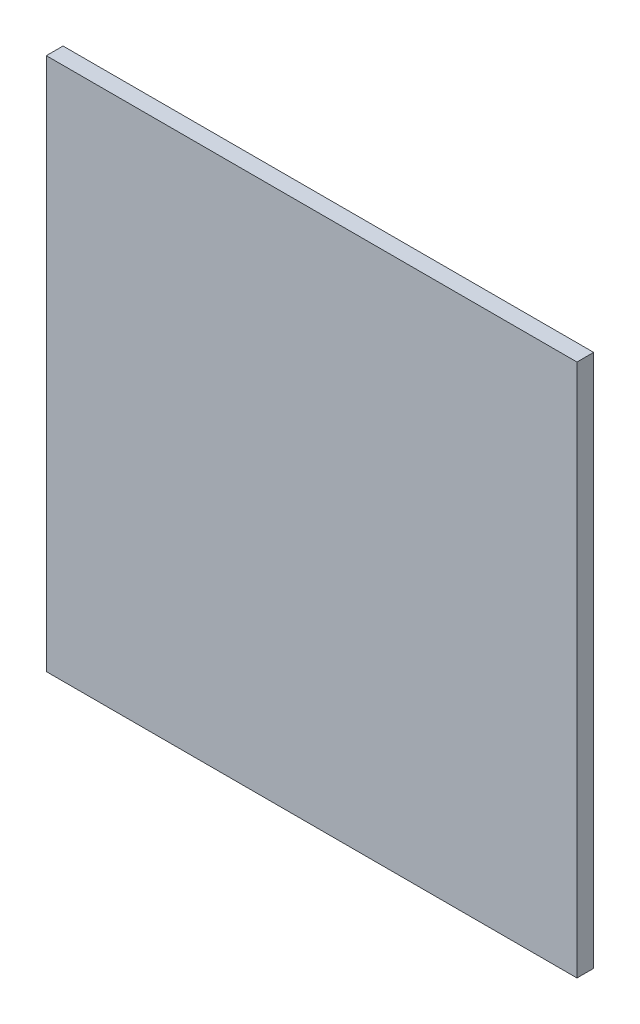
ISO-10303-21;
HEADER;
FILE_DESCRIPTION(('STEP AP214'),'2;1');
FILE_NAME('part.step','',(''),(''),'','','');
FILE_SCHEMA(('AUTOMOTIVE_DESIGN { 1 0 10303 214 1 1 1 1 }'));
ENDSEC;
DATA;
#1=APPLICATION_CONTEXT('core data for automotive mechanical design processes');
#2=APPLICATION_PROTOCOL_DEFINITION('international standard','automotive_design',2000,#1);
#3=PRODUCT_CONTEXT('',#1,'mechanical');
#4=PRODUCT('Part','Part','',(#3));
#5=PRODUCT_RELATED_PRODUCT_CATEGORY('part','',(#4));
#6=PRODUCT_DEFINITION_FORMATION('','',#4);
#7=PRODUCT_DEFINITION_CONTEXT('part definition',#1,'design');
#8=PRODUCT_DEFINITION('design','',#6,#7);
#9=PRODUCT_DEFINITION_SHAPE('','',#8);
#10=(LENGTH_UNIT() NAMED_UNIT(*) SI_UNIT(.MILLI.,.METRE.));
#11=(NAMED_UNIT(*) PLANE_ANGLE_UNIT() SI_UNIT($,.RADIAN.));
#12=(NAMED_UNIT(*) SI_UNIT($,.STERADIAN.) SOLID_ANGLE_UNIT());
#13=UNCERTAINTY_MEASURE_WITH_UNIT(LENGTH_MEASURE(1.E-05),#10,'distance_accuracy_value','');
#14=(GEOMETRIC_REPRESENTATION_CONTEXT(3) GLOBAL_UNCERTAINTY_ASSIGNED_CONTEXT((#13)) GLOBAL_UNIT_ASSIGNED_CONTEXT((#10,
#11,#12)) REPRESENTATION_CONTEXT('',''));
#15=CARTESIAN_POINT('',(0.,0.,0.));
#16=DIRECTION('',(0.,0.,1.));
#17=DIRECTION('',(1.,0.,0.));
#18=AXIS2_PLACEMENT_3D('',#15,#16,#17);
#19=CARTESIAN_POINT('',(-40.5473581800681,24.0513832683013,3.));
#20=DIRECTION('',(1.,0.,0.));
#21=DIRECTION('',(0.,0.,-1.));
#22=AXIS2_PLACEMENT_3D('',#19,#20,#21);
#23=PLANE('',#22);
#24=DIRECTION('',(0.,-1.,0.));
#25=VECTOR('',#24,1.);
#26=CARTESIAN_POINT('',(-40.5473581800681,24.0513832683013,0.));
#27=LINE('',#26,#25);
#28=CARTESIAN_POINT('',(-40.5473581800681,24.0513832683013,0.));
#29=VERTEX_POINT('',#28);
#30=CARTESIAN_POINT('',(-40.5473581800681,-71.6504559144682,0.));
#31=VERTEX_POINT('',#30);
#32=EDGE_CURVE('E96',#29,#31,#27,.T.);
#33=ORIENTED_EDGE('',*,*,#32,.T.);
#34=DIRECTION('',(0.,0.,-1.));
#35=VECTOR('',#34,1.);
#36=CARTESIAN_POINT('',(-40.5473581800681,-71.6504559144682,3.));
#37=LINE('',#36,#35);
#38=CARTESIAN_POINT('',(-40.5473581800681,-71.6504559144682,3.));
#39=VERTEX_POINT('',#38);
#40=EDGE_CURVE('E11',#39,#31,#37,.T.);
#41=ORIENTED_EDGE('',*,*,#40,.F.);
#42=DIRECTION('',(0.,-1.,0.));
#43=VECTOR('',#42,1.);
#44=CARTESIAN_POINT('',(-40.5473581800681,24.0513832683013,3.));
#45=LINE('',#44,#43);
#46=CARTESIAN_POINT('',(-40.5473581800681,24.0513832683013,3.));
#47=VERTEX_POINT('',#46);
#48=EDGE_CURVE('E84',#47,#39,#45,.T.);
#49=ORIENTED_EDGE('',*,*,#48,.F.);
#50=DIRECTION('',(0.,0.,-1.));
#51=VECTOR('',#50,1.);
#52=CARTESIAN_POINT('',(-40.5473581800681,24.0513832683013,3.));
#53=LINE('',#52,#51);
#54=EDGE_CURVE('E92',#47,#29,#53,.T.);
#55=ORIENTED_EDGE('',*,*,#54,.T.);
#56=EDGE_LOOP('',(#33,#41,#49,#55));
#57=FACE_BOUND('',#56,.T.);
#58=ADVANCED_FACE('F33',(#57),#23,.F.);
#59=CARTESIAN_POINT('',(-40.5473581800681,-71.6504559144682,3.));
#60=DIRECTION('',(0.,1.,0.));
#61=DIRECTION('',(0.,0.,1.));
#62=AXIS2_PLACEMENT_3D('',#59,#60,#61);
#63=PLANE('',#62);
#64=DIRECTION('',(1.,0.,0.));
#65=VECTOR('',#64,1.);
#66=CARTESIAN_POINT('',(-40.5473581800681,-71.6504559144682,0.));
#67=LINE('',#66,#65);
#68=CARTESIAN_POINT('',(54.6507871122657,-71.6504559144682,0.));
#69=VERTEX_POINT('',#68);
#70=EDGE_CURVE('E88',#31,#69,#67,.T.);
#71=ORIENTED_EDGE('',*,*,#70,.T.);
#72=DIRECTION('',(0.,0.,-1.));
#73=VECTOR('',#72,1.);
#74=CARTESIAN_POINT('',(54.6507871122657,-71.6504559144682,3.));
#75=LINE('',#74,#73);
#76=CARTESIAN_POINT('',(54.6507871122657,-71.6504559144682,3.));
#77=VERTEX_POINT('',#76);
#78=EDGE_CURVE('E41',#77,#69,#75,.T.);
#79=ORIENTED_EDGE('',*,*,#78,.F.);
#80=DIRECTION('',(1.,0.,0.));
#81=VECTOR('',#80,1.);
#82=CARTESIAN_POINT('',(-40.5473581800681,-71.6504559144682,3.));
#83=LINE('',#82,#81);
#84=EDGE_CURVE('E79',#39,#77,#83,.T.);
#85=ORIENTED_EDGE('',*,*,#84,.F.);
#86=ORIENTED_EDGE('',*,*,#40,.T.);
#87=EDGE_LOOP('',(#71,#79,#85,#86));
#88=FACE_BOUND('',#87,.T.);
#89=ADVANCED_FACE('F87',(#88),#63,.F.);
#90=CARTESIAN_POINT('',(54.6507871122657,24.0513832683013,3.));
#91=DIRECTION('',(-1.,0.,0.));
#92=DIRECTION('',(0.,0.,1.));
#93=AXIS2_PLACEMENT_3D('',#90,#91,#92);
#94=PLANE('',#93);
#95=DIRECTION('',(0.,1.,0.));
#96=VECTOR('',#95,1.);
#97=CARTESIAN_POINT('',(54.6507871122657,24.0513832683013,0.));
#98=LINE('',#97,#96);
#99=CARTESIAN_POINT('',(54.6507871122657,24.0513832683013,0.));
#100=VERTEX_POINT('',#99);
#101=EDGE_CURVE('E66',#69,#100,#98,.T.);
#102=ORIENTED_EDGE('',*,*,#101,.T.);
#103=DIRECTION('',(0.,0.,-1.));
#104=VECTOR('',#103,1.);
#105=CARTESIAN_POINT('',(54.6507871122657,24.0513832683013,3.));
#106=LINE('',#105,#104);
#107=CARTESIAN_POINT('',(54.6507871122657,24.0513832683013,3.));
#108=VERTEX_POINT('',#107);
#109=EDGE_CURVE('E89',#108,#100,#106,.T.);
#110=ORIENTED_EDGE('',*,*,#109,.F.);
#111=DIRECTION('',(0.,1.,0.));
#112=VECTOR('',#111,1.);
#113=CARTESIAN_POINT('',(54.6507871122657,24.0513832683013,3.));
#114=LINE('',#113,#112);
#115=EDGE_CURVE('E82',#77,#108,#114,.T.);
#116=ORIENTED_EDGE('',*,*,#115,.F.);
#117=ORIENTED_EDGE('',*,*,#78,.T.);
#118=EDGE_LOOP('',(#102,#110,#116,#117));
#119=FACE_BOUND('',#118,.T.);
#120=ADVANCED_FACE('F90',(#119),#94,.F.);
#121=CARTESIAN_POINT('',(-40.5473581800681,24.0513832683013,3.));
#122=DIRECTION('',(0.,-1.,0.));
#123=DIRECTION('',(0.,0.,-1.));
#124=AXIS2_PLACEMENT_3D('',#121,#122,#123);
#125=PLANE('',#124);
#126=DIRECTION('',(-1.,0.,0.));
#127=VECTOR('',#126,1.);
#128=CARTESIAN_POINT('',(-40.5473581800681,24.0513832683013,0.));
#129=LINE('',#128,#127);
#130=EDGE_CURVE('E72',#100,#29,#129,.T.);
#131=ORIENTED_EDGE('',*,*,#130,.T.);
#132=ORIENTED_EDGE('',*,*,#54,.F.);
#133=DIRECTION('',(-1.,0.,0.));
#134=VECTOR('',#133,1.);
#135=CARTESIAN_POINT('',(-40.5473581800681,24.0513832683013,3.));
#136=LINE('',#135,#134);
#137=EDGE_CURVE('E49',#108,#47,#136,.T.);
#138=ORIENTED_EDGE('',*,*,#137,.F.);
#139=ORIENTED_EDGE('',*,*,#109,.T.);
#140=EDGE_LOOP('',(#131,#132,#138,#139));
#141=FACE_BOUND('',#140,.T.);
#142=ADVANCED_FACE('F103',(#141),#125,.F.);
#143=CARTESIAN_POINT('',(0.,0.,3.));
#144=DIRECTION('',(0.,0.,1.));
#145=DIRECTION('',(1.,0.,0.));
#146=AXIS2_PLACEMENT_3D('',#143,#144,#145);
#147=PLANE('',#146);
#148=ORIENTED_EDGE('',*,*,#48,.T.);
#149=ORIENTED_EDGE('',*,*,#84,.T.);
#150=ORIENTED_EDGE('',*,*,#115,.T.);
#151=ORIENTED_EDGE('',*,*,#137,.T.);
#152=EDGE_LOOP('',(#148,#149,#150,#151));
#153=FACE_BOUND('',#152,.T.);
#154=ADVANCED_FACE('F80',(#153),#147,.T.);
#155=CARTESIAN_POINT('',(0.,0.,0.));
#156=DIRECTION('',(0.,0.,1.));
#157=DIRECTION('',(1.,0.,0.));
#158=AXIS2_PLACEMENT_3D('',#155,#156,#157);
#159=PLANE('',#158);
#160=ORIENTED_EDGE('',*,*,#32,.F.);
#161=ORIENTED_EDGE('',*,*,#130,.F.);
#162=ORIENTED_EDGE('',*,*,#101,.F.);
#163=ORIENTED_EDGE('',*,*,#70,.F.);
#164=EDGE_LOOP('',(#160,#161,#162,#163));
#165=FACE_BOUND('',#164,.T.);
#166=ADVANCED_FACE('F106',(#165),#159,.F.);
#167=CLOSED_SHELL('',(#58,#89,#120,#142,#154,#166));
#168=MANIFOLD_SOLID_BREP('B2',#167);
#169=ADVANCED_BREP_SHAPE_REPRESENTATION('',(#18,#168),#14);
#170=SHAPE_DEFINITION_REPRESENTATION(#9,#169);
ENDSEC;
END-ISO-10303-21;
